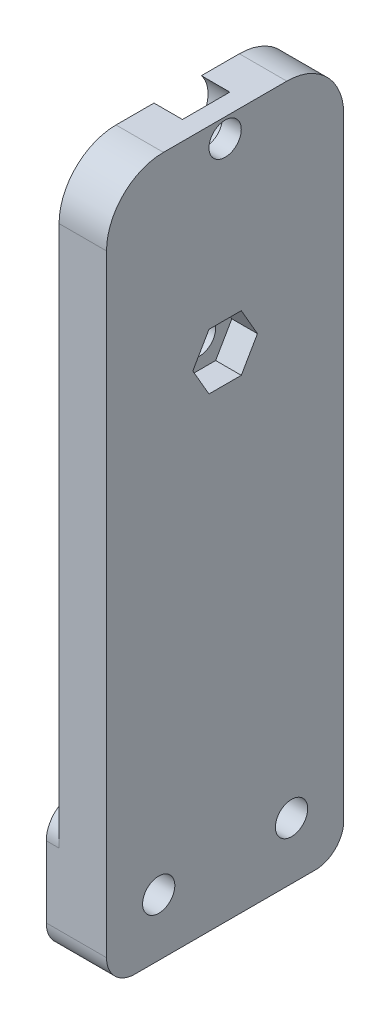
ISO-10303-21;
HEADER;
FILE_DESCRIPTION(('STEP AP214'),'2;1');
FILE_NAME('part.step','',(''),(''),'','','');
FILE_SCHEMA(('AUTOMOTIVE_DESIGN { 1 0 10303 214 1 1 1 1 }'));
ENDSEC;
DATA;
#1=APPLICATION_CONTEXT('core data for automotive mechanical design processes');
#2=APPLICATION_PROTOCOL_DEFINITION('international standard','automotive_design',2000,#1);
#3=PRODUCT_CONTEXT('',#1,'mechanical');
#4=PRODUCT('Part','Part','',(#3));
#5=PRODUCT_RELATED_PRODUCT_CATEGORY('part','',(#4));
#6=PRODUCT_DEFINITION_FORMATION('','',#4);
#7=PRODUCT_DEFINITION_CONTEXT('part definition',#1,'design');
#8=PRODUCT_DEFINITION('design','',#6,#7);
#9=PRODUCT_DEFINITION_SHAPE('','',#8);
#10=(LENGTH_UNIT() NAMED_UNIT(*) SI_UNIT(.MILLI.,.METRE.));
#11=(NAMED_UNIT(*) PLANE_ANGLE_UNIT() SI_UNIT($,.RADIAN.));
#12=(NAMED_UNIT(*) SI_UNIT($,.STERADIAN.) SOLID_ANGLE_UNIT());
#13=UNCERTAINTY_MEASURE_WITH_UNIT(LENGTH_MEASURE(1.E-05),#10,'distance_accuracy_value','');
#14=(GEOMETRIC_REPRESENTATION_CONTEXT(3) GLOBAL_UNCERTAINTY_ASSIGNED_CONTEXT((#13)) GLOBAL_UNIT_ASSIGNED_CONTEXT((#10,
#11,#12)) REPRESENTATION_CONTEXT('',''));
#15=CARTESIAN_POINT('',(0.,0.,0.));
#16=DIRECTION('',(0.,0.,1.));
#17=DIRECTION('',(1.,0.,0.));
#18=AXIS2_PLACEMENT_3D('',#15,#16,#17);
#19=CARTESIAN_POINT('',(-21.9,342.,7.5));
#20=DIRECTION('',(0.,-1.,0.));
#21=DIRECTION('',(0.,0.,-1.));
#22=AXIS2_PLACEMENT_3D('',#19,#20,#21);
#23=PLANE('',#22);
#24=DIRECTION('',(-1.,0.,0.));
#25=VECTOR('',#24,1.);
#26=CARTESIAN_POINT('',(-23.9,342.,16.4979991993594));
#27=LINE('',#26,#25);
#28=CARTESIAN_POINT('',(-26.9,342.,16.4979991993594));
#29=VERTEX_POINT('',#28);
#30=CARTESIAN_POINT('',(-23.9,342.,16.4979991993594));
#31=VERTEX_POINT('',#30);
#32=EDGE_CURVE('E184',#29,#31,#27,.F.);
#33=ORIENTED_EDGE('',*,*,#32,.F.);
#34=DIRECTION('',(0.,0.,1.));
#35=VECTOR('',#34,1.);
#36=CARTESIAN_POINT('',(-26.9,342.,7.5));
#37=LINE('',#36,#35);
#38=CARTESIAN_POINT('',(-26.9,342.,20.5));
#39=VERTEX_POINT('',#38);
#40=EDGE_CURVE('E291',#29,#39,#37,.T.);
#41=ORIENTED_EDGE('',*,*,#40,.T.);
#42=DIRECTION('',(-1.,0.,0.));
#43=VECTOR('',#42,1.);
#44=CARTESIAN_POINT('',(-21.9,342.,20.5));
#45=LINE('',#44,#43);
#46=CARTESIAN_POINT('',(-21.9,342.,20.5));
#47=VERTEX_POINT('',#46);
#48=EDGE_CURVE('E307',#47,#39,#45,.T.);
#49=ORIENTED_EDGE('',*,*,#48,.F.);
#50=DIRECTION('',(0.,0.,1.));
#51=VECTOR('',#50,1.);
#52=CARTESIAN_POINT('',(-21.9,342.,7.5));
#53=LINE('',#52,#51);
#54=CARTESIAN_POINT('',(-21.9,342.,7.5));
#55=VERTEX_POINT('',#54);
#56=EDGE_CURVE('E276',#55,#47,#53,.T.);
#57=ORIENTED_EDGE('',*,*,#56,.F.);
#58=DIRECTION('',(-1.,0.,0.));
#59=VECTOR('',#58,1.);
#60=CARTESIAN_POINT('',(-21.9,342.,7.5));
#61=LINE('',#60,#59);
#62=CARTESIAN_POINT('',(-26.9,342.,7.5));
#63=VERTEX_POINT('',#62);
#64=EDGE_CURVE('E309',#55,#63,#61,.T.);
#65=ORIENTED_EDGE('',*,*,#64,.T.);
#66=CARTESIAN_POINT('',(-26.9,342.,11.5020008006406));
#67=VERTEX_POINT('',#66);
#68=EDGE_CURVE('E188',#63,#67,#37,.T.);
#69=ORIENTED_EDGE('',*,*,#68,.T.);
#70=DIRECTION('',(-1.,0.,0.));
#71=VECTOR('',#70,1.);
#72=CARTESIAN_POINT('',(-23.9,342.,11.5020008006406));
#73=LINE('',#72,#71);
#74=CARTESIAN_POINT('',(-23.9,342.,11.5020008006406));
#75=VERTEX_POINT('',#74);
#76=EDGE_CURVE('E52',#75,#67,#73,.T.);
#77=ORIENTED_EDGE('',*,*,#76,.F.);
#78=DIRECTION('',(0.,0.,1.));
#79=VECTOR('',#78,1.);
#80=CARTESIAN_POINT('',(-23.9,342.,7.5));
#81=LINE('',#80,#79);
#82=EDGE_CURVE('E177',#75,#31,#81,.T.);
#83=ORIENTED_EDGE('',*,*,#82,.T.);
#84=EDGE_LOOP('',(#33,#41,#49,#57,#65,#69,#77,#83));
#85=FACE_BOUND('',#84,.T.);
#86=ADVANCED_FACE('F39',(#85),#23,.F.);
#87=CARTESIAN_POINT('',(-21.9,271.5,4.5));
#88=DIRECTION('',(1.,0.,0.));
#89=DIRECTION('',(0.,0.,-1.));
#90=AXIS2_PLACEMENT_3D('',#87,#88,#89);
#91=PLANE('',#90);
#92=CARTESIAN_POINT('',(-21.9,271.5,4.5));
#93=DIRECTION('',(1.,0.,0.));
#94=DIRECTION('',(0.,0.,-1.));
#95=AXIS2_PLACEMENT_3D('',#92,#93,#94);
#96=CIRCLE('',#95,3.);
#97=CARTESIAN_POINT('',(-21.9,268.5,4.5));
#98=VERTEX_POINT('',#97);
#99=CARTESIAN_POINT('',(-21.9,271.5,1.5));
#100=VERTEX_POINT('',#99);
#101=EDGE_CURVE('E271',#98,#100,#96,.T.);
#102=ORIENTED_EDGE('',*,*,#101,.T.);
#103=DIRECTION('',(0.,1.,0.));
#104=VECTOR('',#103,1.);
#105=CARTESIAN_POINT('',(-21.9,271.5,1.5));
#106=LINE('',#105,#104);
#107=CARTESIAN_POINT('',(-21.9,336.,1.5));
#108=VERTEX_POINT('',#107);
#109=EDGE_CURVE('E273',#100,#108,#106,.T.);
#110=ORIENTED_EDGE('',*,*,#109,.T.);
#111=CARTESIAN_POINT('',(-21.9,336.,7.5));
#112=DIRECTION('',(1.,0.,0.));
#113=DIRECTION('',(0.,0.,-1.));
#114=AXIS2_PLACEMENT_3D('',#111,#112,#113);
#115=CIRCLE('',#114,6.);
#116=EDGE_CURVE('E280',#108,#55,#115,.T.);
#117=ORIENTED_EDGE('',*,*,#116,.T.);
#118=ORIENTED_EDGE('',*,*,#56,.T.);
#119=CARTESIAN_POINT('',(-21.9,336.,20.5));
#120=DIRECTION('',(1.,0.,0.));
#121=DIRECTION('',(0.,0.,-1.));
#122=AXIS2_PLACEMENT_3D('',#119,#120,#121);
#123=CIRCLE('',#122,6.);
#124=CARTESIAN_POINT('',(-21.9,336.,26.5));
#125=VERTEX_POINT('',#124);
#126=EDGE_CURVE('E284',#47,#125,#123,.T.);
#127=ORIENTED_EDGE('',*,*,#126,.T.);
#128=DIRECTION('',(0.,-1.,0.));
#129=VECTOR('',#128,1.);
#130=CARTESIAN_POINT('',(-21.9,336.,26.5));
#131=LINE('',#130,#129);
#132=CARTESIAN_POINT('',(-21.9,271.5,26.5));
#133=VERTEX_POINT('',#132);
#134=EDGE_CURVE('E285',#125,#133,#131,.T.);
#135=ORIENTED_EDGE('',*,*,#134,.T.);
#136=CARTESIAN_POINT('',(-21.9,271.5,23.5));
#137=DIRECTION('',(1.,0.,0.));
#138=DIRECTION('',(0.,0.,-1.));
#139=AXIS2_PLACEMENT_3D('',#136,#137,#138);
#140=CIRCLE('',#139,3.);
#141=CARTESIAN_POINT('',(-21.9,268.5,23.5));
#142=VERTEX_POINT('',#141);
#143=EDGE_CURVE('E282',#133,#142,#140,.T.);
#144=ORIENTED_EDGE('',*,*,#143,.T.);
#145=DIRECTION('',(0.,0.,-1.));
#146=VECTOR('',#145,1.);
#147=CARTESIAN_POINT('',(-21.9,268.5,23.5));
#148=LINE('',#147,#146);
#149=EDGE_CURVE('E290',#142,#98,#148,.T.);
#150=ORIENTED_EDGE('',*,*,#149,.T.);
#151=EDGE_LOOP('',(#102,#110,#117,#118,#127,#135,#144,#150));
#152=FACE_BOUND('',#151,.T.);
#153=CARTESIAN_POINT('',(-21.9,274.5,7.));
#154=DIRECTION('',(1.,0.,0.));
#155=DIRECTION('',(0.,0.,-1.));
#156=AXIS2_PLACEMENT_3D('',#153,#154,#155);
#157=CIRCLE('',#156,1.7);
#158=CARTESIAN_POINT('',(-21.9,274.5,5.3));
#159=VERTEX_POINT('',#158);
#160=EDGE_CURVE('E224',#159,#159,#157,.F.);
#161=ORIENTED_EDGE('',*,*,#160,.T.);
#162=EDGE_LOOP('',(#161));
#163=FACE_BOUND('',#162,.T.);
#164=CARTESIAN_POINT('',(-21.9,274.5,21.));
#165=DIRECTION('',(1.,0.,0.));
#166=DIRECTION('',(0.,0.,-1.));
#167=AXIS2_PLACEMENT_3D('',#164,#165,#166);
#168=CIRCLE('',#167,1.7);
#169=CARTESIAN_POINT('',(-21.9,274.5,19.3));
#170=VERTEX_POINT('',#169);
#171=EDGE_CURVE('E230',#170,#170,#168,.F.);
#172=ORIENTED_EDGE('',*,*,#171,.T.);
#173=EDGE_LOOP('',(#172));
#174=FACE_BOUND('',#173,.T.);
#175=CARTESIAN_POINT('',(-21.9,340.,14.));
#176=DIRECTION('',(1.,0.,0.));
#177=DIRECTION('',(0.,0.,-1.));
#178=AXIS2_PLACEMENT_3D('',#175,#176,#177);
#179=CIRCLE('',#178,1.7);
#180=CARTESIAN_POINT('',(-21.9,340.,12.3));
#181=VERTEX_POINT('',#180);
#182=EDGE_CURVE('E232',#181,#181,#179,.F.);
#183=ORIENTED_EDGE('',*,*,#182,.T.);
#184=EDGE_LOOP('',(#183));
#185=FACE_BOUND('',#184,.T.);
#186=DIRECTION('',(0.,0.866025403784439,-0.499999999999999));
#187=VECTOR('',#186,1.);
#188=CARTESIAN_POINT('',(-21.9,289.338620667976,35.3973973338828));
#189=LINE('',#188,#187);
#190=CARTESIAN_POINT('',(-21.9,320.5,17.4063665882188));
#191=VERTEX_POINT('',#190);
#192=CARTESIAN_POINT('',(-21.9,323.45,15.7031832941094));
#193=VERTEX_POINT('',#192);
#194=EDGE_CURVE('E349',#191,#193,#189,.T.);
#195=ORIENTED_EDGE('',*,*,#194,.T.);
#196=DIRECTION('',(0.,0.,-1.));
#197=VECTOR('',#196,1.);
#198=CARTESIAN_POINT('',(-21.9,323.45,4.5));
#199=LINE('',#198,#197);
#200=CARTESIAN_POINT('',(-21.9,323.45,12.2968167058906));
#201=VERTEX_POINT('',#200);
#202=EDGE_CURVE('E50',#193,#201,#199,.T.);
#203=ORIENTED_EDGE('',*,*,#202,.T.);
#204=DIRECTION('',(0.,-0.866025403784439,-0.499999999999999));
#205=VECTOR('',#204,1.);
#206=CARTESIAN_POINT('',(-21.9,281.111379332024,-12.1473973338828));
#207=LINE('',#206,#205);
#208=CARTESIAN_POINT('',(-21.9,320.5,10.5936334117812));
#209=VERTEX_POINT('',#208);
#210=EDGE_CURVE('E326',#201,#209,#207,.T.);
#211=ORIENTED_EDGE('',*,*,#210,.T.);
#212=DIRECTION('',(0.,-0.866025403784439,0.499999999999999));
#213=VECTOR('',#212,1.);
#214=CARTESIAN_POINT('',(-21.9,286.388620667976,30.2878474515546));
#215=LINE('',#214,#213);
#216=CARTESIAN_POINT('',(-21.9,317.55,12.2968167058906));
#217=VERTEX_POINT('',#216);
#218=EDGE_CURVE('E337',#209,#217,#215,.T.);
#219=ORIENTED_EDGE('',*,*,#218,.T.);
#220=DIRECTION('',(0.,0.,1.));
#221=VECTOR('',#220,1.);
#222=CARTESIAN_POINT('',(-21.9,317.55,4.5));
#223=LINE('',#222,#221);
#224=CARTESIAN_POINT('',(-21.9,317.55,15.7031832941094));
#225=VERTEX_POINT('',#224);
#226=EDGE_CURVE('E344',#217,#225,#223,.T.);
#227=ORIENTED_EDGE('',*,*,#226,.T.);
#228=DIRECTION('',(0.,0.866025403784439,0.499999999999999));
#229=VECTOR('',#228,1.);
#230=CARTESIAN_POINT('',(-21.9,278.161379332024,-7.03784745155461));
#231=LINE('',#230,#229);
#232=EDGE_CURVE('E347',#225,#191,#231,.T.);
#233=ORIENTED_EDGE('',*,*,#232,.T.);
#234=EDGE_LOOP('',(#195,#203,#211,#219,#227,#233));
#235=FACE_BOUND('',#234,.T.);
#236=ADVANCED_FACE('F364',(#152,#163,#174,#185,#235),#91,.T.);
#237=CARTESIAN_POINT('',(-21.7,320.5,14.));
#238=DIRECTION('',(-1.,0.,0.));
#239=DIRECTION('',(0.,0.,1.));
#240=AXIS2_PLACEMENT_3D('',#237,#238,#239);
#241=CYLINDRICAL_SURFACE('',#240,1.7);
#242=CARTESIAN_POINT('',(-25.9,320.5,14.));
#243=DIRECTION('',(1.,0.,0.));
#244=DIRECTION('',(0.,0.,-1.));
#245=AXIS2_PLACEMENT_3D('',#242,#243,#244);
#246=CIRCLE('',#245,1.7);
#247=CARTESIAN_POINT('',(-25.9,320.5,12.3));
#248=VERTEX_POINT('',#247);
#249=EDGE_CURVE('E328',#248,#248,#246,.F.);
#250=ORIENTED_EDGE('',*,*,#249,.T.);
#251=EDGE_LOOP('',(#250));
#252=FACE_BOUND('',#251,.T.);
#253=CARTESIAN_POINT('',(-24.6,320.5,14.));
#254=DIRECTION('',(1.,0.,0.));
#255=DIRECTION('',(0.,0.,-1.));
#256=AXIS2_PLACEMENT_3D('',#253,#254,#255);
#257=CIRCLE('',#256,1.7);
#258=CARTESIAN_POINT('',(-24.6,320.5,12.3));
#259=VERTEX_POINT('',#258);
#260=EDGE_CURVE('E225',#259,#259,#257,.T.);
#261=ORIENTED_EDGE('',*,*,#260,.T.);
#262=EDGE_LOOP('',(#261));
#263=FACE_BOUND('',#262,.T.);
#264=ADVANCED_FACE('F366',(#252,#263),#241,.F.);
#265=CARTESIAN_POINT('',(-21.9,271.5,4.5));
#266=DIRECTION('',(-1.,0.,0.));
#267=DIRECTION('',(0.,0.,1.));
#268=AXIS2_PLACEMENT_3D('',#265,#266,#267);
#269=CYLINDRICAL_SURFACE('',#268,3.);
#270=DIRECTION('',(-1.,0.,0.));
#271=VECTOR('',#270,1.);
#272=CARTESIAN_POINT('',(-21.9,268.5,4.5));
#273=LINE('',#272,#271);
#274=CARTESIAN_POINT('',(-28.25,268.5,4.5));
#275=VERTEX_POINT('',#274);
#276=EDGE_CURVE('E286',#98,#275,#273,.T.);
#277=ORIENTED_EDGE('',*,*,#276,.T.);
#278=CARTESIAN_POINT('',(-28.25,271.5,4.5));
#279=DIRECTION('',(1.,0.,0.));
#280=DIRECTION('',(0.,0.,-1.));
#281=AXIS2_PLACEMENT_3D('',#278,#279,#280);
#282=CIRCLE('',#281,3.);
#283=CARTESIAN_POINT('',(-28.25,271.5,1.5));
#284=VERTEX_POINT('',#283);
#285=EDGE_CURVE('E236',#275,#284,#282,.T.);
#286=ORIENTED_EDGE('',*,*,#285,.T.);
#287=DIRECTION('',(-1.,0.,0.));
#288=VECTOR('',#287,1.);
#289=CARTESIAN_POINT('',(-21.9,271.5,1.5));
#290=LINE('',#289,#288);
#291=EDGE_CURVE('E312',#100,#284,#290,.T.);
#292=ORIENTED_EDGE('',*,*,#291,.F.);
#293=ORIENTED_EDGE('',*,*,#101,.F.);
#294=EDGE_LOOP('',(#277,#286,#292,#293));
#295=FACE_BOUND('',#294,.T.);
#296=ADVANCED_FACE('F41',(#295),#269,.T.);
#297=CARTESIAN_POINT('',(-21.9,271.5,1.5));
#298=DIRECTION('',(0.,0.,1.));
#299=DIRECTION('',(1.,0.,0.));
#300=AXIS2_PLACEMENT_3D('',#297,#298,#299);
#301=PLANE('',#300);
#302=ORIENTED_EDGE('',*,*,#291,.T.);
#303=DIRECTION('',(0.,1.,0.));
#304=VECTOR('',#303,1.);
#305=CARTESIAN_POINT('',(-28.25,271.5,1.5));
#306=LINE('',#305,#304);
#307=CARTESIAN_POINT('',(-28.25,279.,1.50000000000003));
#308=VERTEX_POINT('',#307);
#309=EDGE_CURVE('E244',#284,#308,#306,.T.);
#310=ORIENTED_EDGE('',*,*,#309,.T.);
#311=DIRECTION('',(-1.,0.,0.));
#312=VECTOR('',#311,1.);
#313=CARTESIAN_POINT('',(-26.7,279.,1.50000000000003));
#314=LINE('',#313,#312);
#315=CARTESIAN_POINT('',(-26.9,279.,1.5));
#316=VERTEX_POINT('',#315);
#317=EDGE_CURVE('E268',#316,#308,#314,.T.);
#318=ORIENTED_EDGE('',*,*,#317,.F.);
#319=DIRECTION('',(0.,1.,0.));
#320=VECTOR('',#319,1.);
#321=CARTESIAN_POINT('',(-26.9,271.5,1.5));
#322=LINE('',#321,#320);
#323=CARTESIAN_POINT('',(-26.9,336.,1.5));
#324=VERTEX_POINT('',#323);
#325=EDGE_CURVE('E269',#316,#324,#322,.T.);
#326=ORIENTED_EDGE('',*,*,#325,.T.);
#327=DIRECTION('',(-1.,0.,0.));
#328=VECTOR('',#327,1.);
#329=CARTESIAN_POINT('',(-21.9,336.,1.5));
#330=LINE('',#329,#328);
#331=EDGE_CURVE('E315',#108,#324,#330,.T.);
#332=ORIENTED_EDGE('',*,*,#331,.F.);
#333=ORIENTED_EDGE('',*,*,#109,.F.);
#334=EDGE_LOOP('',(#302,#310,#318,#326,#332,#333));
#335=FACE_BOUND('',#334,.T.);
#336=ADVANCED_FACE('F414',(#335),#301,.F.);
#337=CARTESIAN_POINT('',(-21.9,336.,7.5));
#338=DIRECTION('',(-1.,0.,0.));
#339=DIRECTION('',(0.,0.,1.));
#340=AXIS2_PLACEMENT_3D('',#337,#338,#339);
#341=CYLINDRICAL_SURFACE('',#340,6.);
#342=CARTESIAN_POINT('',(-26.9,336.,7.5));
#343=DIRECTION('',(1.,0.,0.));
#344=DIRECTION('',(0.,0.,-1.));
#345=AXIS2_PLACEMENT_3D('',#342,#343,#344);
#346=CIRCLE('',#345,6.);
#347=EDGE_CURVE('E292',#324,#63,#346,.T.);
#348=ORIENTED_EDGE('',*,*,#347,.T.);
#349=ORIENTED_EDGE('',*,*,#64,.F.);
#350=ORIENTED_EDGE('',*,*,#116,.F.);
#351=ORIENTED_EDGE('',*,*,#331,.T.);
#352=EDGE_LOOP('',(#348,#349,#350,#351));
#353=FACE_BOUND('',#352,.T.);
#354=ADVANCED_FACE('F412',(#353),#341,.T.);
#355=CARTESIAN_POINT('',(-21.9,336.,20.5));
#356=DIRECTION('',(-1.,0.,0.));
#357=DIRECTION('',(0.,0.,1.));
#358=AXIS2_PLACEMENT_3D('',#355,#356,#357);
#359=CYLINDRICAL_SURFACE('',#358,6.);
#360=CARTESIAN_POINT('',(-26.9,336.,20.5));
#361=DIRECTION('',(1.,0.,0.));
#362=DIRECTION('',(0.,0.,-1.));
#363=AXIS2_PLACEMENT_3D('',#360,#361,#362);
#364=CIRCLE('',#363,6.);
#365=CARTESIAN_POINT('',(-26.9,336.,26.5));
#366=VERTEX_POINT('',#365);
#367=EDGE_CURVE('E293',#39,#366,#364,.T.);
#368=ORIENTED_EDGE('',*,*,#367,.T.);
#369=DIRECTION('',(-1.,0.,0.));
#370=VECTOR('',#369,1.);
#371=CARTESIAN_POINT('',(-21.9,336.,26.5));
#372=LINE('',#371,#370);
#373=EDGE_CURVE('E301',#125,#366,#372,.T.);
#374=ORIENTED_EDGE('',*,*,#373,.F.);
#375=ORIENTED_EDGE('',*,*,#126,.F.);
#376=ORIENTED_EDGE('',*,*,#48,.T.);
#377=EDGE_LOOP('',(#368,#374,#375,#376));
#378=FACE_BOUND('',#377,.T.);
#379=ADVANCED_FACE('F408',(#378),#359,.T.);
#380=CARTESIAN_POINT('',(-21.9,336.,26.5));
#381=DIRECTION('',(0.,0.,-1.));
#382=DIRECTION('',(-1.,0.,0.));
#383=AXIS2_PLACEMENT_3D('',#380,#381,#382);
#384=PLANE('',#383);
#385=DIRECTION('',(0.,-1.,0.));
#386=VECTOR('',#385,1.);
#387=CARTESIAN_POINT('',(-28.25,279.,26.5));
#388=LINE('',#387,#386);
#389=CARTESIAN_POINT('',(-28.25,279.,26.5));
#390=VERTEX_POINT('',#389);
#391=CARTESIAN_POINT('',(-28.25,271.5,26.5));
#392=VERTEX_POINT('',#391);
#393=EDGE_CURVE('E251',#390,#392,#388,.T.);
#394=ORIENTED_EDGE('',*,*,#393,.T.);
#395=DIRECTION('',(-1.,0.,0.));
#396=VECTOR('',#395,1.);
#397=CARTESIAN_POINT('',(-21.9,271.5,26.5));
#398=LINE('',#397,#396);
#399=EDGE_CURVE('E305',#133,#392,#398,.T.);
#400=ORIENTED_EDGE('',*,*,#399,.F.);
#401=ORIENTED_EDGE('',*,*,#134,.F.);
#402=ORIENTED_EDGE('',*,*,#373,.T.);
#403=DIRECTION('',(0.,-1.,0.));
#404=VECTOR('',#403,1.);
#405=CARTESIAN_POINT('',(-26.9,336.,26.5));
#406=LINE('',#405,#404);
#407=CARTESIAN_POINT('',(-26.9,279.,26.5));
#408=VERTEX_POINT('',#407);
#409=EDGE_CURVE('E274',#366,#408,#406,.T.);
#410=ORIENTED_EDGE('',*,*,#409,.T.);
#411=DIRECTION('',(-1.,0.,0.));
#412=VECTOR('',#411,1.);
#413=CARTESIAN_POINT('',(-26.7,279.,26.5));
#414=LINE('',#413,#412);
#415=EDGE_CURVE('E265',#408,#390,#414,.T.);
#416=ORIENTED_EDGE('',*,*,#415,.T.);
#417=EDGE_LOOP('',(#394,#400,#401,#402,#410,#416));
#418=FACE_BOUND('',#417,.T.);
#419=ADVANCED_FACE('F446',(#418),#384,.F.);
#420=CARTESIAN_POINT('',(-21.9,271.5,23.5));
#421=DIRECTION('',(-1.,0.,0.));
#422=DIRECTION('',(0.,0.,1.));
#423=AXIS2_PLACEMENT_3D('',#420,#421,#422);
#424=CYLINDRICAL_SURFACE('',#423,3.);
#425=ORIENTED_EDGE('',*,*,#399,.T.);
#426=CARTESIAN_POINT('',(-28.25,271.5,23.5));
#427=DIRECTION('',(1.,0.,0.));
#428=DIRECTION('',(0.,0.,-1.));
#429=AXIS2_PLACEMENT_3D('',#426,#427,#428);
#430=CIRCLE('',#429,3.);
#431=CARTESIAN_POINT('',(-28.25,268.5,23.5));
#432=VERTEX_POINT('',#431);
#433=EDGE_CURVE('E258',#392,#432,#430,.T.);
#434=ORIENTED_EDGE('',*,*,#433,.T.);
#435=DIRECTION('',(-1.,0.,0.));
#436=VECTOR('',#435,1.);
#437=CARTESIAN_POINT('',(-21.9,268.5,23.5));
#438=LINE('',#437,#436);
#439=EDGE_CURVE('E297',#142,#432,#438,.T.);
#440=ORIENTED_EDGE('',*,*,#439,.F.);
#441=ORIENTED_EDGE('',*,*,#143,.F.);
#442=EDGE_LOOP('',(#425,#434,#440,#441));
#443=FACE_BOUND('',#442,.T.);
#444=ADVANCED_FACE('F445',(#443),#424,.T.);
#445=CARTESIAN_POINT('',(-21.9,268.5,23.5));
#446=DIRECTION('',(0.,1.,0.));
#447=DIRECTION('',(0.,0.,1.));
#448=AXIS2_PLACEMENT_3D('',#445,#446,#447);
#449=PLANE('',#448);
#450=ORIENTED_EDGE('',*,*,#439,.T.);
#451=DIRECTION('',(0.,0.,-1.));
#452=VECTOR('',#451,1.);
#453=CARTESIAN_POINT('',(-28.25,268.5,23.5));
#454=LINE('',#453,#452);
#455=EDGE_CURVE('E259',#432,#275,#454,.T.);
#456=ORIENTED_EDGE('',*,*,#455,.T.);
#457=ORIENTED_EDGE('',*,*,#276,.F.);
#458=ORIENTED_EDGE('',*,*,#149,.F.);
#459=EDGE_LOOP('',(#450,#456,#457,#458));
#460=FACE_BOUND('',#459,.T.);
#461=ADVANCED_FACE('F436',(#460),#449,.F.);
#462=CARTESIAN_POINT('',(-26.9,271.5,4.5));
#463=DIRECTION('',(1.,0.,0.));
#464=DIRECTION('',(0.,0.,-1.));
#465=AXIS2_PLACEMENT_3D('',#462,#463,#464);
#466=PLANE('',#465);
#467=CARTESIAN_POINT('',(-26.9,340.,14.));
#468=DIRECTION('',(1.,0.,0.));
#469=DIRECTION('',(0.,0.,-1.));
#470=AXIS2_PLACEMENT_3D('',#467,#468,#469);
#471=CIRCLE('',#470,3.2);
#472=EDGE_CURVE('E11',#67,#29,#471,.F.);
#473=ORIENTED_EDGE('',*,*,#472,.F.);
#474=ORIENTED_EDGE('',*,*,#68,.F.);
#475=ORIENTED_EDGE('',*,*,#347,.F.);
#476=ORIENTED_EDGE('',*,*,#325,.F.);
#477=CARTESIAN_POINT('',(-26.9,279.,4.5));
#478=DIRECTION('',(1.,0.,0.));
#479=DIRECTION('',(0.,0.,-1.));
#480=AXIS2_PLACEMENT_3D('',#477,#478,#479);
#481=CIRCLE('',#480,2.99999999999997);
#482=CARTESIAN_POINT('',(-26.9,282.,4.5));
#483=VERTEX_POINT('',#482);
#484=EDGE_CURVE('E323',#483,#316,#481,.F.);
#485=ORIENTED_EDGE('',*,*,#484,.F.);
#486=DIRECTION('',(0.,0.,-1.));
#487=VECTOR('',#486,1.);
#488=CARTESIAN_POINT('',(-26.9,282.,4.5));
#489=LINE('',#488,#487);
#490=CARTESIAN_POINT('',(-26.9,282.,23.5));
#491=VERTEX_POINT('',#490);
#492=EDGE_CURVE('E319',#491,#483,#489,.T.);
#493=ORIENTED_EDGE('',*,*,#492,.F.);
#494=CARTESIAN_POINT('',(-26.9,279.,23.5));
#495=DIRECTION('',(1.,0.,0.));
#496=DIRECTION('',(0.,0.,-1.));
#497=AXIS2_PLACEMENT_3D('',#494,#495,#496);
#498=CIRCLE('',#497,2.99999999999997);
#499=EDGE_CURVE('E320',#408,#491,#498,.F.);
#500=ORIENTED_EDGE('',*,*,#499,.F.);
#501=ORIENTED_EDGE('',*,*,#409,.F.);
#502=ORIENTED_EDGE('',*,*,#367,.F.);
#503=ORIENTED_EDGE('',*,*,#40,.F.);
#504=EDGE_LOOP('',(#473,#474,#475,#476,#485,#493,#500,#501,#502,#503));
#505=FACE_BOUND('',#504,.T.);
#506=CARTESIAN_POINT('',(-26.9,320.5,14.));
#507=DIRECTION('',(1.,0.,0.));
#508=DIRECTION('',(0.,0.,-1.));
#509=AXIS2_PLACEMENT_3D('',#506,#507,#508);
#510=CIRCLE('',#509,7.25);
#511=CARTESIAN_POINT('',(-26.9,320.5,6.75));
#512=VERTEX_POINT('',#511);
#513=EDGE_CURVE('E240',#512,#512,#510,.F.);
#514=ORIENTED_EDGE('',*,*,#513,.F.);
#515=EDGE_LOOP('',(#514));
#516=FACE_BOUND('',#515,.T.);
#517=ADVANCED_FACE('F461',(#505,#516),#466,.F.);
#518=CARTESIAN_POINT('',(-26.7,279.,4.5));
#519=DIRECTION('',(-1.,0.,0.));
#520=DIRECTION('',(0.,0.,1.));
#521=AXIS2_PLACEMENT_3D('',#518,#519,#520);
#522=CYLINDRICAL_SURFACE('',#521,2.99999999999997);
#523=DIRECTION('',(-1.,0.,0.));
#524=VECTOR('',#523,1.);
#525=CARTESIAN_POINT('',(-26.7,282.,4.5));
#526=LINE('',#525,#524);
#527=CARTESIAN_POINT('',(-28.25,282.,4.5));
#528=VERTEX_POINT('',#527);
#529=EDGE_CURVE('E266',#483,#528,#526,.T.);
#530=ORIENTED_EDGE('',*,*,#529,.F.);
#531=ORIENTED_EDGE('',*,*,#484,.T.);
#532=ORIENTED_EDGE('',*,*,#317,.T.);
#533=CARTESIAN_POINT('',(-28.25,279.,4.5));
#534=DIRECTION('',(1.,0.,0.));
#535=DIRECTION('',(0.,0.,-1.));
#536=AXIS2_PLACEMENT_3D('',#533,#534,#535);
#537=CIRCLE('',#536,2.99999999999997);
#538=EDGE_CURVE('E243',#308,#528,#537,.T.);
#539=ORIENTED_EDGE('',*,*,#538,.T.);
#540=EDGE_LOOP('',(#530,#531,#532,#539));
#541=FACE_BOUND('',#540,.T.);
#542=ADVANCED_FACE('F460',(#541),#522,.T.);
#543=CARTESIAN_POINT('',(-26.7,282.,4.5));
#544=DIRECTION('',(0.,-1.,0.));
#545=DIRECTION('',(0.,0.,-1.));
#546=AXIS2_PLACEMENT_3D('',#543,#544,#545);
#547=PLANE('',#546);
#548=DIRECTION('',(-1.,0.,0.));
#549=VECTOR('',#548,1.);
#550=CARTESIAN_POINT('',(-26.7,282.,23.5));
#551=LINE('',#550,#549);
#552=CARTESIAN_POINT('',(-28.25,282.,23.5));
#553=VERTEX_POINT('',#552);
#554=EDGE_CURVE('E262',#491,#553,#551,.T.);
#555=ORIENTED_EDGE('',*,*,#554,.F.);
#556=ORIENTED_EDGE('',*,*,#492,.T.);
#557=ORIENTED_EDGE('',*,*,#529,.T.);
#558=DIRECTION('',(0.,0.,1.));
#559=VECTOR('',#558,1.);
#560=CARTESIAN_POINT('',(-28.25,282.,4.5));
#561=LINE('',#560,#559);
#562=EDGE_CURVE('E250',#528,#553,#561,.T.);
#563=ORIENTED_EDGE('',*,*,#562,.T.);
#564=EDGE_LOOP('',(#555,#556,#557,#563));
#565=FACE_BOUND('',#564,.T.);
#566=ADVANCED_FACE('F451',(#565),#547,.F.);
#567=CARTESIAN_POINT('',(-26.7,279.,23.5));
#568=DIRECTION('',(-1.,0.,0.));
#569=DIRECTION('',(0.,0.,1.));
#570=AXIS2_PLACEMENT_3D('',#567,#568,#569);
#571=CYLINDRICAL_SURFACE('',#570,2.99999999999997);
#572=ORIENTED_EDGE('',*,*,#415,.F.);
#573=ORIENTED_EDGE('',*,*,#499,.T.);
#574=ORIENTED_EDGE('',*,*,#554,.T.);
#575=CARTESIAN_POINT('',(-28.25,279.,23.5));
#576=DIRECTION('',(1.,0.,0.));
#577=DIRECTION('',(0.,0.,-1.));
#578=AXIS2_PLACEMENT_3D('',#575,#576,#577);
#579=CIRCLE('',#578,2.99999999999997);
#580=EDGE_CURVE('E248',#553,#390,#579,.T.);
#581=ORIENTED_EDGE('',*,*,#580,.T.);
#582=EDGE_LOOP('',(#572,#573,#574,#581));
#583=FACE_BOUND('',#582,.T.);
#584=ADVANCED_FACE('F452',(#583),#571,.T.);
#585=CARTESIAN_POINT('',(-28.25,271.5,4.5));
#586=DIRECTION('',(1.,0.,0.));
#587=DIRECTION('',(0.,0.,-1.));
#588=AXIS2_PLACEMENT_3D('',#585,#586,#587);
#589=PLANE('',#588);
#590=CARTESIAN_POINT('',(-28.25,274.5,21.));
#591=DIRECTION('',(1.,0.,0.));
#592=DIRECTION('',(0.,0.,-1.));
#593=AXIS2_PLACEMENT_3D('',#590,#591,#592);
#594=CIRCLE('',#593,1.7);
#595=CARTESIAN_POINT('',(-28.25,274.5,19.3));
#596=VERTEX_POINT('',#595);
#597=EDGE_CURVE('E229',#596,#596,#594,.F.);
#598=ORIENTED_EDGE('',*,*,#597,.F.);
#599=EDGE_LOOP('',(#598));
#600=FACE_BOUND('',#599,.T.);
#601=CARTESIAN_POINT('',(-28.25,274.5,7.));
#602=DIRECTION('',(1.,0.,0.));
#603=DIRECTION('',(0.,0.,-1.));
#604=AXIS2_PLACEMENT_3D('',#601,#602,#603);
#605=CIRCLE('',#604,1.7);
#606=CARTESIAN_POINT('',(-28.25,274.5,5.3));
#607=VERTEX_POINT('',#606);
#608=EDGE_CURVE('E226',#607,#607,#605,.F.);
#609=ORIENTED_EDGE('',*,*,#608,.F.);
#610=EDGE_LOOP('',(#609));
#611=FACE_BOUND('',#610,.T.);
#612=ORIENTED_EDGE('',*,*,#285,.F.);
#613=ORIENTED_EDGE('',*,*,#455,.F.);
#614=ORIENTED_EDGE('',*,*,#433,.F.);
#615=ORIENTED_EDGE('',*,*,#393,.F.);
#616=ORIENTED_EDGE('',*,*,#580,.F.);
#617=ORIENTED_EDGE('',*,*,#562,.F.);
#618=ORIENTED_EDGE('',*,*,#538,.F.);
#619=ORIENTED_EDGE('',*,*,#309,.F.);
#620=EDGE_LOOP('',(#612,#613,#614,#615,#616,#617,#618,#619));
#621=FACE_BOUND('',#620,.T.);
#622=ADVANCED_FACE('F429',(#600,#611,#621),#589,.F.);
#623=CARTESIAN_POINT('',(-25.9,320.5,14.));
#624=DIRECTION('',(-1.,0.,0.));
#625=DIRECTION('',(0.,0.,1.));
#626=AXIS2_PLACEMENT_3D('',#623,#624,#625);
#627=CYLINDRICAL_SURFACE('',#626,7.25);
#628=CARTESIAN_POINT('',(-25.9,320.5,14.));
#629=DIRECTION('',(1.,0.,0.));
#630=DIRECTION('',(0.,0.,-1.));
#631=AXIS2_PLACEMENT_3D('',#628,#629,#630);
#632=CIRCLE('',#631,7.25);
#633=CARTESIAN_POINT('',(-25.9,320.5,6.75));
#634=VERTEX_POINT('',#633);
#635=EDGE_CURVE('E231',#634,#634,#632,.T.);
#636=ORIENTED_EDGE('',*,*,#635,.T.);
#637=EDGE_LOOP('',(#636));
#638=FACE_BOUND('',#637,.T.);
#639=ORIENTED_EDGE('',*,*,#513,.T.);
#640=EDGE_LOOP('',(#639));
#641=FACE_BOUND('',#640,.T.);
#642=ADVANCED_FACE('F482',(#638,#641),#627,.F.);
#643=CARTESIAN_POINT('',(-25.9,320.5,14.));
#644=DIRECTION('',(1.,0.,0.));
#645=DIRECTION('',(0.,0.,-1.));
#646=AXIS2_PLACEMENT_3D('',#643,#644,#645);
#647=PLANE('',#646);
#648=ORIENTED_EDGE('',*,*,#249,.F.);
#649=EDGE_LOOP('',(#648));
#650=FACE_BOUND('',#649,.T.);
#651=ORIENTED_EDGE('',*,*,#635,.F.);
#652=EDGE_LOOP('',(#651));
#653=FACE_BOUND('',#652,.T.);
#654=ADVANCED_FACE('F487',(#650,#653),#647,.F.);
#655=CARTESIAN_POINT('',(-21.7,274.5,7.));
#656=DIRECTION('',(-1.,0.,0.));
#657=DIRECTION('',(0.,0.,1.));
#658=AXIS2_PLACEMENT_3D('',#655,#656,#657);
#659=CYLINDRICAL_SURFACE('',#658,1.7);
#660=ORIENTED_EDGE('',*,*,#160,.F.);
#661=EDGE_LOOP('',(#660));
#662=FACE_BOUND('',#661,.T.);
#663=ORIENTED_EDGE('',*,*,#608,.T.);
#664=EDGE_LOOP('',(#663));
#665=FACE_BOUND('',#664,.T.);
#666=ADVANCED_FACE('F476',(#662,#665),#659,.F.);
#667=CARTESIAN_POINT('',(-21.7,274.5,21.));
#668=DIRECTION('',(-1.,0.,0.));
#669=DIRECTION('',(0.,0.,1.));
#670=AXIS2_PLACEMENT_3D('',#667,#668,#669);
#671=CYLINDRICAL_SURFACE('',#670,1.7);
#672=ORIENTED_EDGE('',*,*,#171,.F.);
#673=EDGE_LOOP('',(#672));
#674=FACE_BOUND('',#673,.T.);
#675=ORIENTED_EDGE('',*,*,#597,.T.);
#676=EDGE_LOOP('',(#675));
#677=FACE_BOUND('',#676,.T.);
#678=ADVANCED_FACE('F363',(#674,#677),#671,.F.);
#679=CARTESIAN_POINT('',(-21.7,340.,14.));
#680=DIRECTION('',(-1.,0.,0.));
#681=DIRECTION('',(0.,0.,1.));
#682=AXIS2_PLACEMENT_3D('',#679,#680,#681);
#683=CYLINDRICAL_SURFACE('',#682,1.7);
#684=CARTESIAN_POINT('',(-23.9,340.,14.));
#685=DIRECTION('',(1.,0.,0.));
#686=DIRECTION('',(0.,0.,-1.));
#687=AXIS2_PLACEMENT_3D('',#684,#685,#686);
#688=CIRCLE('',#687,1.7);
#689=CARTESIAN_POINT('',(-23.9,340.,12.3));
#690=VERTEX_POINT('',#689);
#691=EDGE_CURVE('E182',#690,#690,#688,.T.);
#692=ORIENTED_EDGE('',*,*,#691,.F.);
#693=EDGE_LOOP('',(#692));
#694=FACE_BOUND('',#693,.T.);
#695=ORIENTED_EDGE('',*,*,#182,.F.);
#696=EDGE_LOOP('',(#695));
#697=FACE_BOUND('',#696,.T.);
#698=ADVANCED_FACE('F360',(#694,#697),#683,.F.);
#699=CARTESIAN_POINT('',(-21.7,323.45,12.2968167058906));
#700=DIRECTION('',(0.,-1.,0.));
#701=DIRECTION('',(0.,0.,-1.));
#702=AXIS2_PLACEMENT_3D('',#699,#700,#701);
#703=PLANE('',#702);
#704=DIRECTION('',(-1.,0.,0.));
#705=VECTOR('',#704,1.);
#706=CARTESIAN_POINT('',(-21.7,323.45,15.7031832941094));
#707=LINE('',#706,#705);
#708=CARTESIAN_POINT('',(-24.6,323.45,15.7031832941094));
#709=VERTEX_POINT('',#708);
#710=EDGE_CURVE('E219',#193,#709,#707,.T.);
#711=ORIENTED_EDGE('',*,*,#710,.T.);
#712=DIRECTION('',(0.,0.,1.));
#713=VECTOR('',#712,1.);
#714=CARTESIAN_POINT('',(-24.6,323.45,12.2968167058906));
#715=LINE('',#714,#713);
#716=CARTESIAN_POINT('',(-24.6,323.45,12.2968167058906));
#717=VERTEX_POINT('',#716);
#718=EDGE_CURVE('E192',#717,#709,#715,.T.);
#719=ORIENTED_EDGE('',*,*,#718,.F.);
#720=DIRECTION('',(-1.,0.,0.));
#721=VECTOR('',#720,1.);
#722=CARTESIAN_POINT('',(-21.7,323.45,12.2968167058906));
#723=LINE('',#722,#721);
#724=EDGE_CURVE('E211',#201,#717,#723,.T.);
#725=ORIENTED_EDGE('',*,*,#724,.F.);
#726=ORIENTED_EDGE('',*,*,#202,.F.);
#727=EDGE_LOOP('',(#711,#719,#725,#726));
#728=FACE_BOUND('',#727,.T.);
#729=ADVANCED_FACE('F358',(#728),#703,.T.);
#730=CARTESIAN_POINT('',(-21.7,323.45,15.7031832941094));
#731=DIRECTION('',(0.,-0.499999999999999,-0.866025403784439));
#732=DIRECTION('',(0.,0.866025403784439,-0.499999999999999));
#733=AXIS2_PLACEMENT_3D('',#730,#731,#732);
#734=PLANE('',#733);
#735=DIRECTION('',(-1.,0.,0.));
#736=VECTOR('',#735,1.);
#737=CARTESIAN_POINT('',(-21.7,320.5,17.4063665882188));
#738=LINE('',#737,#736);
#739=CARTESIAN_POINT('',(-24.6,320.5,17.4063665882188));
#740=VERTEX_POINT('',#739);
#741=EDGE_CURVE('E217',#191,#740,#738,.T.);
#742=ORIENTED_EDGE('',*,*,#741,.T.);
#743=DIRECTION('',(0.,-0.866025403784439,0.499999999999999));
#744=VECTOR('',#743,1.);
#745=CARTESIAN_POINT('',(-24.6,323.45,15.7031832941094));
#746=LINE('',#745,#744);
#747=EDGE_CURVE('E198',#709,#740,#746,.T.);
#748=ORIENTED_EDGE('',*,*,#747,.F.);
#749=ORIENTED_EDGE('',*,*,#710,.F.);
#750=ORIENTED_EDGE('',*,*,#194,.F.);
#751=EDGE_LOOP('',(#742,#748,#749,#750));
#752=FACE_BOUND('',#751,.T.);
#753=ADVANCED_FACE('F372',(#752),#734,.T.);
#754=CARTESIAN_POINT('',(-21.7,320.5,17.4063665882188));
#755=DIRECTION('',(0.,0.499999999999999,-0.866025403784439));
#756=DIRECTION('',(0.,0.866025403784439,0.499999999999999));
#757=AXIS2_PLACEMENT_3D('',#754,#755,#756);
#758=PLANE('',#757);
#759=DIRECTION('',(-1.,0.,0.));
#760=VECTOR('',#759,1.);
#761=CARTESIAN_POINT('',(-21.7,317.55,15.7031832941094));
#762=LINE('',#761,#760);
#763=CARTESIAN_POINT('',(-24.6,317.55,15.7031832941094));
#764=VERTEX_POINT('',#763);
#765=EDGE_CURVE('E216',#225,#764,#762,.T.);
#766=ORIENTED_EDGE('',*,*,#765,.T.);
#767=DIRECTION('',(0.,-0.866025403784439,-0.499999999999999));
#768=VECTOR('',#767,1.);
#769=CARTESIAN_POINT('',(-24.6,320.5,17.4063665882188));
#770=LINE('',#769,#768);
#771=EDGE_CURVE('E200',#740,#764,#770,.T.);
#772=ORIENTED_EDGE('',*,*,#771,.F.);
#773=ORIENTED_EDGE('',*,*,#741,.F.);
#774=ORIENTED_EDGE('',*,*,#232,.F.);
#775=EDGE_LOOP('',(#766,#772,#773,#774));
#776=FACE_BOUND('',#775,.T.);
#777=ADVANCED_FACE('F378',(#776),#758,.T.);
#778=CARTESIAN_POINT('',(-21.7,317.55,15.7031832941094));
#779=DIRECTION('',(0.,1.,0.));
#780=DIRECTION('',(0.,0.,1.));
#781=AXIS2_PLACEMENT_3D('',#778,#779,#780);
#782=PLANE('',#781);
#783=DIRECTION('',(-1.,0.,0.));
#784=VECTOR('',#783,1.);
#785=CARTESIAN_POINT('',(-21.7,317.55,12.2968167058906));
#786=LINE('',#785,#784);
#787=CARTESIAN_POINT('',(-24.6,317.55,12.2968167058906));
#788=VERTEX_POINT('',#787);
#789=EDGE_CURVE('E212',#217,#788,#786,.T.);
#790=ORIENTED_EDGE('',*,*,#789,.T.);
#791=DIRECTION('',(0.,0.,-1.));
#792=VECTOR('',#791,1.);
#793=CARTESIAN_POINT('',(-24.6,317.55,15.7031832941094));
#794=LINE('',#793,#792);
#795=EDGE_CURVE('E205',#764,#788,#794,.T.);
#796=ORIENTED_EDGE('',*,*,#795,.F.);
#797=ORIENTED_EDGE('',*,*,#765,.F.);
#798=ORIENTED_EDGE('',*,*,#226,.F.);
#799=EDGE_LOOP('',(#790,#796,#797,#798));
#800=FACE_BOUND('',#799,.T.);
#801=ADVANCED_FACE('F384',(#800),#782,.T.);
#802=CARTESIAN_POINT('',(-21.7,317.55,12.2968167058906));
#803=DIRECTION('',(0.,0.499999999999999,0.866025403784439));
#804=DIRECTION('',(0.,-0.866025403784439,0.499999999999999));
#805=AXIS2_PLACEMENT_3D('',#802,#803,#804);
#806=PLANE('',#805);
#807=DIRECTION('',(-1.,0.,0.));
#808=VECTOR('',#807,1.);
#809=CARTESIAN_POINT('',(-21.7,320.5,10.5936334117812));
#810=LINE('',#809,#808);
#811=CARTESIAN_POINT('',(-24.6,320.5,10.5936334117812));
#812=VERTEX_POINT('',#811);
#813=EDGE_CURVE('E64',#209,#812,#810,.T.);
#814=ORIENTED_EDGE('',*,*,#813,.T.);
#815=DIRECTION('',(0.,0.866025403784439,-0.499999999999999));
#816=VECTOR('',#815,1.);
#817=CARTESIAN_POINT('',(-24.6,317.55,12.2968167058906));
#818=LINE('',#817,#816);
#819=EDGE_CURVE('E202',#788,#812,#818,.T.);
#820=ORIENTED_EDGE('',*,*,#819,.F.);
#821=ORIENTED_EDGE('',*,*,#789,.F.);
#822=ORIENTED_EDGE('',*,*,#218,.F.);
#823=EDGE_LOOP('',(#814,#820,#821,#822));
#824=FACE_BOUND('',#823,.T.);
#825=ADVANCED_FACE('F389',(#824),#806,.T.);
#826=CARTESIAN_POINT('',(-21.7,320.5,10.5936334117812));
#827=DIRECTION('',(0.,-0.499999999999999,0.866025403784439));
#828=DIRECTION('',(0.,-0.866025403784439,-0.499999999999999));
#829=AXIS2_PLACEMENT_3D('',#826,#827,#828);
#830=PLANE('',#829);
#831=ORIENTED_EDGE('',*,*,#724,.T.);
#832=DIRECTION('',(0.,0.866025403784439,0.499999999999999));
#833=VECTOR('',#832,1.);
#834=CARTESIAN_POINT('',(-24.6,320.5,10.5936334117812));
#835=LINE('',#834,#833);
#836=EDGE_CURVE('E208',#812,#717,#835,.T.);
#837=ORIENTED_EDGE('',*,*,#836,.F.);
#838=ORIENTED_EDGE('',*,*,#813,.F.);
#839=ORIENTED_EDGE('',*,*,#210,.F.);
#840=EDGE_LOOP('',(#831,#837,#838,#839));
#841=FACE_BOUND('',#840,.T.);
#842=ADVANCED_FACE('F388',(#841),#830,.T.);
#843=CARTESIAN_POINT('',(-24.6,0.,0.));
#844=DIRECTION('',(1.,0.,0.));
#845=DIRECTION('',(0.,0.,-1.));
#846=AXIS2_PLACEMENT_3D('',#843,#844,#845);
#847=PLANE('',#846);
#848=ORIENTED_EDGE('',*,*,#260,.F.);
#849=EDGE_LOOP('',(#848));
#850=FACE_BOUND('',#849,.T.);
#851=ORIENTED_EDGE('',*,*,#718,.T.);
#852=ORIENTED_EDGE('',*,*,#747,.T.);
#853=ORIENTED_EDGE('',*,*,#771,.T.);
#854=ORIENTED_EDGE('',*,*,#795,.T.);
#855=ORIENTED_EDGE('',*,*,#819,.T.);
#856=ORIENTED_EDGE('',*,*,#836,.T.);
#857=EDGE_LOOP('',(#851,#852,#853,#854,#855,#856));
#858=FACE_BOUND('',#857,.T.);
#859=ADVANCED_FACE('F385',(#850,#858),#847,.T.);
#860=CARTESIAN_POINT('',(-23.9,340.,14.));
#861=DIRECTION('',(-1.,0.,0.));
#862=DIRECTION('',(0.,0.,1.));
#863=AXIS2_PLACEMENT_3D('',#860,#861,#862);
#864=CYLINDRICAL_SURFACE('',#863,3.2);
#865=ORIENTED_EDGE('',*,*,#32,.T.);
#866=CARTESIAN_POINT('',(-23.9,340.,14.));
#867=DIRECTION('',(1.,0.,0.));
#868=DIRECTION('',(0.,0.,-1.));
#869=AXIS2_PLACEMENT_3D('',#866,#867,#868);
#870=CIRCLE('',#869,3.2);
#871=EDGE_CURVE('E179',#31,#75,#870,.T.);
#872=ORIENTED_EDGE('',*,*,#871,.T.);
#873=ORIENTED_EDGE('',*,*,#76,.T.);
#874=ORIENTED_EDGE('',*,*,#472,.T.);
#875=EDGE_LOOP('',(#865,#872,#873,#874));
#876=FACE_BOUND('',#875,.T.);
#877=ADVANCED_FACE('F181',(#876),#864,.F.);
#878=CARTESIAN_POINT('',(-23.9,340.,14.));
#879=DIRECTION('',(1.,0.,0.));
#880=DIRECTION('',(0.,0.,-1.));
#881=AXIS2_PLACEMENT_3D('',#878,#879,#880);
#882=PLANE('',#881);
#883=ORIENTED_EDGE('',*,*,#691,.T.);
#884=EDGE_LOOP('',(#883));
#885=FACE_BOUND('',#884,.T.);
#886=ORIENTED_EDGE('',*,*,#871,.F.);
#887=ORIENTED_EDGE('',*,*,#82,.F.);
#888=EDGE_LOOP('',(#886,#887));
#889=FACE_BOUND('',#888,.T.);
#890=ADVANCED_FACE('F180',(#885,#889),#882,.F.);
#891=CLOSED_SHELL('',(#86,#236,#264,#296,#336,#354,#379,#419,#444,#461,#517,#542,#566,#584,#622,
#642,#654,#666,#678,#698,#729,#753,#777,#801,#825,#842,#859,#877,#890));
#892=MANIFOLD_SOLID_BREP('B2',#891);
#893=ADVANCED_BREP_SHAPE_REPRESENTATION('',(#18,#892),#14);
#894=SHAPE_DEFINITION_REPRESENTATION(#9,#893);
ENDSEC;
END-ISO-10303-21;
